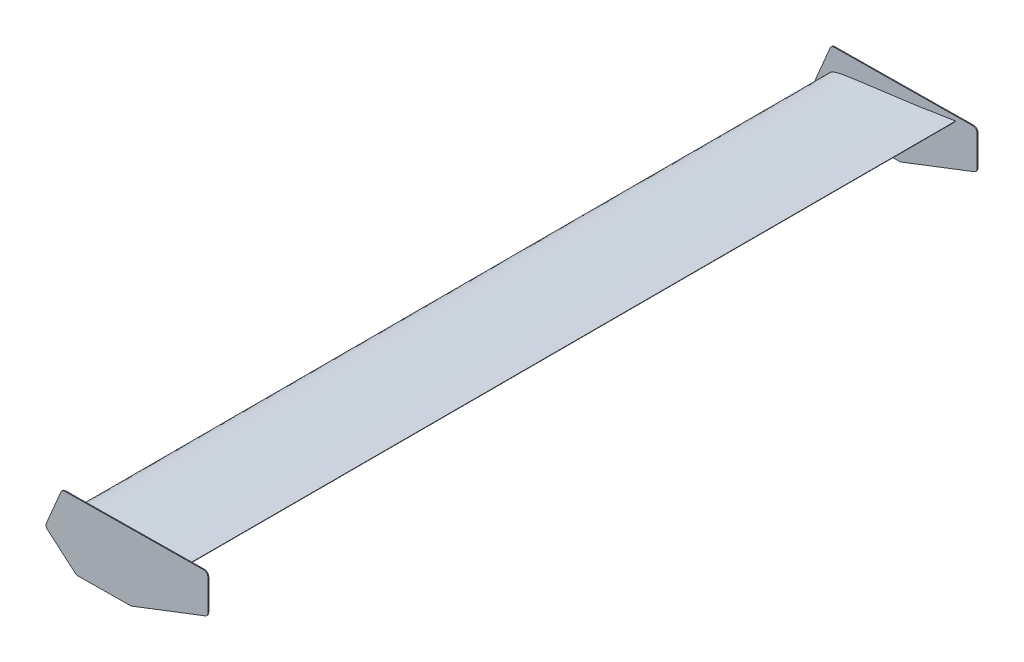
ISO-10303-21;
HEADER;
FILE_DESCRIPTION(('STEP AP214'),'2;1');
FILE_NAME('part.step','',(''),(''),'','','');
FILE_SCHEMA(('AUTOMOTIVE_DESIGN { 1 0 10303 214 1 1 1 1 }'));
ENDSEC;
DATA;
#1=APPLICATION_CONTEXT('core data for automotive mechanical design processes');
#2=APPLICATION_PROTOCOL_DEFINITION('international standard','automotive_design',2000,#1);
#3=PRODUCT_CONTEXT('',#1,'mechanical');
#4=PRODUCT('Part','Part','',(#3));
#5=PRODUCT_RELATED_PRODUCT_CATEGORY('part','',(#4));
#6=PRODUCT_DEFINITION_FORMATION('','',#4);
#7=PRODUCT_DEFINITION_CONTEXT('part definition',#1,'design');
#8=PRODUCT_DEFINITION('design','',#6,#7);
#9=PRODUCT_DEFINITION_SHAPE('','',#8);
#10=(LENGTH_UNIT() NAMED_UNIT(*) SI_UNIT(.MILLI.,.METRE.));
#11=(NAMED_UNIT(*) PLANE_ANGLE_UNIT() SI_UNIT($,.RADIAN.));
#12=(NAMED_UNIT(*) SI_UNIT($,.STERADIAN.) SOLID_ANGLE_UNIT());
#13=UNCERTAINTY_MEASURE_WITH_UNIT(LENGTH_MEASURE(1.E-05),#10,'distance_accuracy_value','');
#14=(GEOMETRIC_REPRESENTATION_CONTEXT(3) GLOBAL_UNCERTAINTY_ASSIGNED_CONTEXT((#13)) GLOBAL_UNIT_ASSIGNED_CONTEXT((#10,
#11,#12)) REPRESENTATION_CONTEXT('',''));
#15=CARTESIAN_POINT('',(0.,0.,0.));
#16=DIRECTION('',(0.,0.,1.));
#17=DIRECTION('',(1.,0.,0.));
#18=AXIS2_PLACEMENT_3D('',#15,#16,#17);
#19=CARTESIAN_POINT('',(0.,0.,899.));
#20=DIRECTION('',(0.,0.,-1.));
#21=DIRECTION('',(-1.,0.,0.));
#22=AXIS2_PLACEMENT_3D('',#19,#20,#21);
#23=PLANE('',#22);
#24=DIRECTION('',(-0.999947428083981,-0.0102538318804609,0.));
#25=VECTOR('',#24,1.);
#26=CARTESIAN_POINT('',(4.19836461655942,59.4066569608688,899.));
#27=LINE('',#26,#25);
#28=CARTESIAN_POINT('',(335.564783335885,62.8046111462092,899.));
#29=VERTEX_POINT('',#28);
#30=CARTESIAN_POINT('',(10.7496298097369,59.4738360644981,899.));
#31=VERTEX_POINT('',#30);
#32=EDGE_CURVE('E240',#29,#31,#27,.T.);
#33=ORIENTED_EDGE('',*,*,#32,.F.);
#34=CARTESIAN_POINT('',(335.667321654689,52.8051368653694,899.));
#35=DIRECTION('',(0.,0.,-1.));
#36=DIRECTION('',(-1.,0.,0.));
#37=AXIS2_PLACEMENT_3D('',#34,#35,#36);
#38=CIRCLE('',#37,10.);
#39=CARTESIAN_POINT('',(345.667321654689,52.8051368653694,899.));
#40=VERTEX_POINT('',#39);
#41=EDGE_CURVE('E277',#29,#40,#38,.T.);
#42=ORIENTED_EDGE('',*,*,#41,.T.);
#43=DIRECTION('',(0.,1.,0.));
#44=VECTOR('',#43,1.);
#45=CARTESIAN_POINT('',(345.667321654689,62.908206321893,899.));
#46=LINE('',#45,#44);
#47=CARTESIAN_POINT('',(345.667321654689,-19.4543841415105,899.));
#48=VERTEX_POINT('',#47);
#49=EDGE_CURVE('E439',#48,#40,#46,.T.);
#50=ORIENTED_EDGE('',*,*,#49,.F.);
#51=CARTESIAN_POINT('',(335.667321654689,-19.4543841415105,899.));
#52=DIRECTION('',(0.,0.,-1.));
#53=DIRECTION('',(-1.,0.,0.));
#54=AXIS2_PLACEMENT_3D('',#51,#52,#53);
#55=CIRCLE('',#54,10.);
#56=CARTESIAN_POINT('',(339.261892028957,-28.7860004979859,899.));
#57=VERTEX_POINT('',#56);
#58=EDGE_CURVE('E274',#48,#57,#55,.T.);
#59=ORIENTED_EDGE('',*,*,#58,.T.);
#60=DIRECTION('',(0.93316163564754,0.35945703742674,0.));
#61=VECTOR('',#60,1.);
#62=CARTESIAN_POINT('',(166.275090380422,-95.4211051348804,899.));
#63=LINE('',#62,#61);
#64=CARTESIAN_POINT('',(167.960784377593,-94.7717700710672,899.));
#65=VERTEX_POINT('',#64);
#66=EDGE_CURVE('E474',#65,#57,#63,.T.);
#67=ORIENTED_EDGE('',*,*,#66,.F.);
#68=CARTESIAN_POINT('',(164.366214003326,-85.4401537145918,899.));
#69=DIRECTION('',(0.,0.,-1.));
#70=DIRECTION('',(-1.,0.,0.));
#71=AXIS2_PLACEMENT_3D('',#68,#69,#70);
#72=CIRCLE('',#71,10.);
#73=CARTESIAN_POINT('',(164.46875232213,-95.4396279954316,899.));
#74=VERTEX_POINT('',#73);
#75=EDGE_CURVE('E271',#65,#74,#72,.T.);
#76=ORIENTED_EDGE('',*,*,#75,.T.);
#77=DIRECTION('',(0.99994742808398,0.010253831880461,0.));
#78=VECTOR('',#77,1.);
#79=CARTESIAN_POINT('',(38.2575012573376,-96.7338449847395,899.));
#80=LINE('',#79,#78);
#81=CARTESIAN_POINT('',(42.0078617050286,-96.6953873974287,899.));
#82=VERTEX_POINT('',#81);
#83=EDGE_CURVE('E470',#82,#74,#80,.T.);
#84=ORIENTED_EDGE('',*,*,#83,.F.);
#85=CARTESIAN_POINT('',(41.905323386224,-86.6959131165889,899.));
#86=DIRECTION('',(0.,0.,-1.));
#87=DIRECTION('',(-1.,0.,0.));
#88=AXIS2_PLACEMENT_3D('',#85,#86,#87);
#89=CIRCLE('',#88,10.);
#90=CARTESIAN_POINT('',(35.4068383285812,-94.2965507185006,899.));
#91=VERTEX_POINT('',#90);
#92=EDGE_CURVE('E262',#82,#91,#89,.T.);
#93=ORIENTED_EDGE('',*,*,#92,.T.);
#94=DIRECTION('',(0.760063760191166,-0.649848505764278,0.));
#95=VECTOR('',#94,1.);
#96=CARTESIAN_POINT('',(-35.2909208199958,-33.8505255955157,899.));
#97=LINE('',#96,#95);
#98=CARTESIAN_POINT('',(-29.7260776200808,-38.6084225348037,899.));
#99=VERTEX_POINT('',#98);
#100=EDGE_CURVE('E466',#99,#91,#97,.T.);
#101=ORIENTED_EDGE('',*,*,#100,.F.);
#102=CARTESIAN_POINT('',(-23.227592562438,-31.007784932892,899.));
#103=DIRECTION('',(0.,0.,-1.));
#104=DIRECTION('',(-1.,0.,0.));
#105=AXIS2_PLACEMENT_3D('',#102,#103,#104);
#106=CIRCLE('',#105,10.);
#107=CARTESIAN_POINT('',(-32.4360484248066,-27.1085105605493,899.));
#108=VERTEX_POINT('',#107);
#109=EDGE_CURVE('E265',#99,#108,#106,.T.);
#110=ORIENTED_EDGE('',*,*,#109,.T.);
#111=DIRECTION('',(-0.38992743723427,-0.920845586236864,0.));
#112=VECTOR('',#111,1.);
#113=CARTESIAN_POINT('',(4.19836461655942,59.4066569608688,899.));
#114=LINE('',#113,#112);
#115=CARTESIAN_POINT('',(1.64371226617284,53.373636156001,899.));
#116=VERTEX_POINT('',#115);
#117=EDGE_CURVE('E462',#116,#108,#114,.T.);
#118=ORIENTED_EDGE('',*,*,#117,.F.);
#119=CARTESIAN_POINT('',(10.8521681285415,49.4743617836583,899.));
#120=DIRECTION('',(0.,0.,-1.));
#121=DIRECTION('',(-1.,0.,0.));
#122=AXIS2_PLACEMENT_3D('',#119,#120,#121);
#123=CIRCLE('',#122,10.);
#124=EDGE_CURVE('E268',#116,#31,#123,.T.);
#125=ORIENTED_EDGE('',*,*,#124,.T.);
#126=EDGE_LOOP('',(#33,#42,#50,#59,#67,#76,#84,#93,#101,#110,#118,#125));
#127=FACE_BOUND('',#126,.T.);
#128=CARTESIAN_POINT('',(295.442575552322,52.0944973198736,899.));
#129=CARTESIAN_POINT('',(290.513405360213,51.2551968737166,899.));
#130=CARTESIAN_POINT('',(280.654798817571,49.5765506620336,899.));
#131=CARTESIAN_POINT('',(260.908662248569,46.3874090889857,899.));
#132=CARTESIAN_POINT('',(236.21205861254,42.4700071835736,899.));
#133=CARTESIAN_POINT('',(206.524649131341,38.0711542068682,899.));
#134=CARTESIAN_POINT('',(176.791016387995,33.9503967885851,899.));
#135=CARTESIAN_POINT('',(147.028226767683,30.0129140809486,899.));
#136=CARTESIAN_POINT('',(117.277393969403,25.9511793318881,899.));
#137=CARTESIAN_POINT('',(92.448783550698,22.8250936622745,899.));
#138=CARTESIAN_POINT('',(72.5868221191492,20.2991131861254,899.));
#139=CARTESIAN_POINT('',(57.6806379696287,18.5022860247391,899.));
#140=CARTESIAN_POINT('',(42.8294512378161,16.3297474729015,899.));
#141=CARTESIAN_POINT('',(30.503324848176,14.208402507249,899.));
#142=CARTESIAN_POINT('',(20.7218923500691,12.0219474188099,899.));
#143=CARTESIAN_POINT('',(13.4174215074088,10.072827447969,899.));
#144=CARTESIAN_POINT('',(7.36001882994766,7.69323810880284,899.));
#145=CARTESIAN_POINT('',(2.41756609867938,4.87324860729172,899.));
#146=CARTESIAN_POINT('',(-1.90572150955162,-0.864008686683522,899.));
#147=CARTESIAN_POINT('',(3.98891879431421,-6.3451713298435,899.));
#148=CARTESIAN_POINT('',(10.1776980472486,-9.31157314368899,899.));
#149=CARTESIAN_POINT('',(17.0903093663387,-11.4872077239985,899.));
#150=CARTESIAN_POINT('',(25.0496216231774,-13.2246530775742,899.));
#151=CARTESIAN_POINT('',(35.4635386523064,-14.7181035313228,899.));
#152=CARTESIAN_POINT('',(48.3138554344482,-15.7525222262547,899.));
#153=CARTESIAN_POINT('',(63.6119343730892,-15.805428879694,899.));
#154=CARTESIAN_POINT('',(78.7288203963591,-15.0112954978334,899.));
#155=CARTESIAN_POINT('',(98.6775886020674,-12.9258913981769,899.));
#156=CARTESIAN_POINT('',(123.359896769198,-8.58669721404438,899.));
#157=CARTESIAN_POINT('',(152.592609753486,-1.48249306985702,899.));
#158=CARTESIAN_POINT('',(181.624153973967,6.78650927043338,899.));
#159=CARTESIAN_POINT('',(210.421609352754,16.2962672485336,899.));
#160=CARTESIAN_POINT('',(239.075022796545,26.7642384033183,899.));
#161=CARTESIAN_POINT('',(262.727569494105,36.4359060625289,899.));
#162=CARTESIAN_POINT('',(281.542489296852,44.7358642078229,899.));
#163=CARTESIAN_POINT('',(290.891307166424,49.1258631647304,899.));
#164=CARTESIAN_POINT('',(295.577022422233,51.3261718425066,899.));
#165=B_SPLINE_CURVE_WITH_KNOTS('',3,(#128,#129,#130,#131,#132,#133,#134,#135,#136,#137,#138,
#139,#140,#141,#142,#143,#144,#145,#146,#147,#148,#149,#150,#151,#152,#153,#154,#155,#156,#157,
#158,#159,#160,#161,#162,#163,#164),.UNSPECIFIED.,.F.,.F.,(4,1,1,1,1,1,1,1,1,1,1,1,1,1,1,1,1,1,
1,1,1,1,1,1,1,1,1,1,1,1,1,1,1,1,4),(0.,0.0244427721061945,0.0488868640389345,0.0977785916589877,
0.146679776180424,0.195594373169575,0.244518129566772,0.293441885963969,0.342378242904188,
0.366848716418896,0.391319189933605,0.415771101598765,0.440213629284816,0.45244886604217,
0.464730985941134,0.477233997408243,0.483852229950494,0.493136970824156,0.506538949171679,
0.514213997148271,0.528080018214651,0.541297784208939,0.554174880744231,0.579429854643616,
0.604273702829676,0.628897262955146,0.653399405638713,0.702284461010814,0.751259990775971,
0.800413393105454,0.849809284276661,0.899479567348494,0.949512346609459,0.974695114289043,1.),.UNSPECIFIED.);
#166=CARTESIAN_POINT('',(295.577022422233,51.3261718425066,899.));
#167=VERTEX_POINT('',#166);
#168=CARTESIAN_POINT('',(295.442575552322,52.0944973198736,899.));
#169=VERTEX_POINT('',#168);
#170=EDGE_CURVE('E252',#167,#169,#165,.F.);
#171=ORIENTED_EDGE('',*,*,#170,.F.);
#172=DIRECTION('',(0.172367781937305,-0.985032663290926,0.));
#173=VECTOR('',#172,1.);
#174=CARTESIAN_POINT('',(295.442575552322,52.0944973198736,899.));
#175=LINE('',#174,#173);
#176=EDGE_CURVE('E245',#169,#167,#175,.T.);
#177=ORIENTED_EDGE('',*,*,#176,.F.);
#178=EDGE_LOOP('',(#171,#177));
#179=FACE_BOUND('',#178,.T.);
#180=ADVANCED_FACE('F47',(#127,#179),#23,.T.);
#181=CARTESIAN_POINT('',(4.19836461655942,59.4066569608688,901.));
#182=DIRECTION('',(0.0102538318804609,-0.999947428083981,0.));
#183=DIRECTION('',(0.999947428083981,0.0102538318804609,0.));
#184=AXIS2_PLACEMENT_3D('',#181,#182,#183);
#185=PLANE('',#184);
#186=DIRECTION('',(-0.999947428083981,-0.0102538318804609,0.));
#187=VECTOR('',#186,1.);
#188=CARTESIAN_POINT('',(4.19836461655942,59.4066569608688,901.));
#189=LINE('',#188,#187);
#190=CARTESIAN_POINT('',(335.564783335885,62.8046111462092,901.));
#191=VERTEX_POINT('',#190);
#192=CARTESIAN_POINT('',(10.7496298097369,59.4738360644981,901.));
#193=VERTEX_POINT('',#192);
#194=EDGE_CURVE('E431',#191,#193,#189,.T.);
#195=ORIENTED_EDGE('',*,*,#194,.F.);
#196=DIRECTION('',(0.,0.,-1.));
#197=VECTOR('',#196,1.);
#198=CARTESIAN_POINT('',(335.564783335885,62.8046111462092,901.));
#199=LINE('',#198,#197);
#200=EDGE_CURVE('E258',#191,#29,#199,.T.);
#201=ORIENTED_EDGE('',*,*,#200,.T.);
#202=ORIENTED_EDGE('',*,*,#32,.T.);
#203=DIRECTION('',(0.,0.,-1.));
#204=VECTOR('',#203,1.);
#205=CARTESIAN_POINT('',(10.7496298097369,59.4738360644981,901.));
#206=LINE('',#205,#204);
#207=EDGE_CURVE('E250',#31,#193,#206,.F.);
#208=ORIENTED_EDGE('',*,*,#207,.T.);
#209=EDGE_LOOP('',(#195,#201,#202,#208));
#210=FACE_BOUND('',#209,.T.);
#211=ADVANCED_FACE('F546',(#210),#185,.F.);
#212=CARTESIAN_POINT('',(4.19836461655942,59.4066569608688,901.));
#213=DIRECTION('',(0.920845586236864,-0.38992743723427,0.));
#214=DIRECTION('',(0.38992743723427,0.920845586236864,0.));
#215=AXIS2_PLACEMENT_3D('',#212,#213,#214);
#216=PLANE('',#215);
#217=DIRECTION('',(-0.38992743723427,-0.920845586236864,0.));
#218=VECTOR('',#217,1.);
#219=CARTESIAN_POINT('',(4.19836461655942,59.4066569608688,901.));
#220=LINE('',#219,#218);
#221=CARTESIAN_POINT('',(1.64371226617284,53.373636156001,901.));
#222=VERTEX_POINT('',#221);
#223=CARTESIAN_POINT('',(-32.4360484248066,-27.1085105605493,901.));
#224=VERTEX_POINT('',#223);
#225=EDGE_CURVE('E438',#222,#224,#220,.T.);
#226=ORIENTED_EDGE('',*,*,#225,.F.);
#227=DIRECTION('',(0.,0.,-1.));
#228=VECTOR('',#227,1.);
#229=CARTESIAN_POINT('',(1.64371226617284,53.373636156001,901.));
#230=LINE('',#229,#228);
#231=EDGE_CURVE('E322',#222,#116,#230,.T.);
#232=ORIENTED_EDGE('',*,*,#231,.T.);
#233=ORIENTED_EDGE('',*,*,#117,.T.);
#234=DIRECTION('',(0.,0.,-1.));
#235=VECTOR('',#234,1.);
#236=CARTESIAN_POINT('',(-32.4360484248066,-27.1085105605493,901.));
#237=LINE('',#236,#235);
#238=EDGE_CURVE('E319',#108,#224,#237,.F.);
#239=ORIENTED_EDGE('',*,*,#238,.T.);
#240=EDGE_LOOP('',(#226,#232,#233,#239));
#241=FACE_BOUND('',#240,.T.);
#242=ADVANCED_FACE('F552',(#241),#216,.F.);
#243=CARTESIAN_POINT('',(-35.2909208199958,-33.8505255955157,901.));
#244=DIRECTION('',(0.649848505764278,0.760063760191167,0.));
#245=DIRECTION('',(-0.760063760191167,0.649848505764278,0.));
#246=AXIS2_PLACEMENT_3D('',#243,#244,#245);
#247=PLANE('',#246);
#248=DIRECTION('',(0.760063760191166,-0.649848505764278,0.));
#249=VECTOR('',#248,1.);
#250=CARTESIAN_POINT('',(-35.2909208199958,-33.8505255955157,901.));
#251=LINE('',#250,#249);
#252=CARTESIAN_POINT('',(-29.7260776200808,-38.6084225348037,901.));
#253=VERTEX_POINT('',#252);
#254=CARTESIAN_POINT('',(35.4068383285812,-94.2965507185006,901.));
#255=VERTEX_POINT('',#254);
#256=EDGE_CURVE('E443',#253,#255,#251,.T.);
#257=ORIENTED_EDGE('',*,*,#256,.F.);
#258=DIRECTION('',(0.,0.,-1.));
#259=VECTOR('',#258,1.);
#260=CARTESIAN_POINT('',(-29.7260776200808,-38.6084225348037,901.));
#261=LINE('',#260,#259);
#262=EDGE_CURVE('E231',#253,#99,#261,.T.);
#263=ORIENTED_EDGE('',*,*,#262,.T.);
#264=ORIENTED_EDGE('',*,*,#100,.T.);
#265=DIRECTION('',(0.,0.,-1.));
#266=VECTOR('',#265,1.);
#267=CARTESIAN_POINT('',(35.4068383285812,-94.2965507185006,901.));
#268=LINE('',#267,#266);
#269=EDGE_CURVE('E326',#91,#255,#268,.F.);
#270=ORIENTED_EDGE('',*,*,#269,.T.);
#271=EDGE_LOOP('',(#257,#263,#264,#270));
#272=FACE_BOUND('',#271,.T.);
#273=ADVANCED_FACE('F570',(#272),#247,.F.);
#274=CARTESIAN_POINT('',(38.2575012573376,-96.7338449847395,901.));
#275=DIRECTION('',(-0.010253831880461,0.999947428083981,0.));
#276=DIRECTION('',(-0.999947428083981,-0.010253831880461,0.));
#277=AXIS2_PLACEMENT_3D('',#274,#275,#276);
#278=PLANE('',#277);
#279=ORIENTED_EDGE('',*,*,#83,.T.);
#280=DIRECTION('',(0.,0.,-1.));
#281=VECTOR('',#280,1.);
#282=CARTESIAN_POINT('',(164.46875232213,-95.4396279954316,901.));
#283=LINE('',#282,#281);
#284=CARTESIAN_POINT('',(164.46875232213,-95.4396279954316,901.));
#285=VERTEX_POINT('',#284);
#286=EDGE_CURVE('E316',#74,#285,#283,.F.);
#287=ORIENTED_EDGE('',*,*,#286,.T.);
#288=DIRECTION('',(0.99994742808398,0.010253831880461,0.));
#289=VECTOR('',#288,1.);
#290=CARTESIAN_POINT('',(38.2575012573376,-96.7338449847395,901.));
#291=LINE('',#290,#289);
#292=CARTESIAN_POINT('',(42.0078617050286,-96.6953873974287,901.));
#293=VERTEX_POINT('',#292);
#294=EDGE_CURVE('E447',#293,#285,#291,.T.);
#295=ORIENTED_EDGE('',*,*,#294,.F.);
#296=DIRECTION('',(0.,0.,-1.));
#297=VECTOR('',#296,1.);
#298=CARTESIAN_POINT('',(42.0078617050286,-96.6953873974287,901.));
#299=LINE('',#298,#297);
#300=EDGE_CURVE('E312',#293,#82,#299,.T.);
#301=ORIENTED_EDGE('',*,*,#300,.T.);
#302=EDGE_LOOP('',(#279,#287,#295,#301));
#303=FACE_BOUND('',#302,.T.);
#304=ADVANCED_FACE('F566',(#303),#278,.F.);
#305=CARTESIAN_POINT('',(166.275090380422,-95.4211051348804,901.));
#306=DIRECTION('',(-0.359457037426739,0.93316163564754,0.));
#307=DIRECTION('',(-0.93316163564754,-0.35945703742674,0.));
#308=AXIS2_PLACEMENT_3D('',#305,#306,#307);
#309=PLANE('',#308);
#310=ORIENTED_EDGE('',*,*,#66,.T.);
#311=DIRECTION('',(0.,0.,-1.));
#312=VECTOR('',#311,1.);
#313=CARTESIAN_POINT('',(339.261892028957,-28.7860004979859,901.));
#314=LINE('',#313,#312);
#315=CARTESIAN_POINT('',(339.261892028957,-28.7860004979859,901.));
#316=VERTEX_POINT('',#315);
#317=EDGE_CURVE('E309',#57,#316,#314,.F.);
#318=ORIENTED_EDGE('',*,*,#317,.T.);
#319=DIRECTION('',(0.93316163564754,0.35945703742674,0.));
#320=VECTOR('',#319,1.);
#321=CARTESIAN_POINT('',(166.275090380422,-95.4211051348804,901.));
#322=LINE('',#321,#320);
#323=CARTESIAN_POINT('',(167.960784377593,-94.7717700710672,901.));
#324=VERTEX_POINT('',#323);
#325=EDGE_CURVE('E451',#324,#316,#322,.T.);
#326=ORIENTED_EDGE('',*,*,#325,.F.);
#327=DIRECTION('',(0.,0.,-1.));
#328=VECTOR('',#327,1.);
#329=CARTESIAN_POINT('',(167.960784377593,-94.7717700710672,901.));
#330=LINE('',#329,#328);
#331=EDGE_CURVE('E305',#324,#65,#330,.T.);
#332=ORIENTED_EDGE('',*,*,#331,.T.);
#333=EDGE_LOOP('',(#310,#318,#326,#332));
#334=FACE_BOUND('',#333,.T.);
#335=ADVANCED_FACE('F562',(#334),#309,.F.);
#336=CARTESIAN_POINT('',(345.667321654689,62.908206321893,901.));
#337=DIRECTION('',(-1.,0.,0.));
#338=DIRECTION('',(0.,0.,1.));
#339=AXIS2_PLACEMENT_3D('',#336,#337,#338);
#340=PLANE('',#339);
#341=ORIENTED_EDGE('',*,*,#49,.T.);
#342=DIRECTION('',(0.,0.,-1.));
#343=VECTOR('',#342,1.);
#344=CARTESIAN_POINT('',(345.667321654689,52.8051368653694,901.));
#345=LINE('',#344,#343);
#346=CARTESIAN_POINT('',(345.667321654689,52.8051368653694,901.));
#347=VERTEX_POINT('',#346);
#348=EDGE_CURVE('E284',#40,#347,#345,.F.);
#349=ORIENTED_EDGE('',*,*,#348,.T.);
#350=DIRECTION('',(0.,1.,0.));
#351=VECTOR('',#350,1.);
#352=CARTESIAN_POINT('',(345.667321654689,62.908206321893,901.));
#353=LINE('',#352,#351);
#354=CARTESIAN_POINT('',(345.667321654689,-19.4543841415105,901.));
#355=VERTEX_POINT('',#354);
#356=EDGE_CURVE('E455',#355,#347,#353,.T.);
#357=ORIENTED_EDGE('',*,*,#356,.F.);
#358=DIRECTION('',(0.,0.,-1.));
#359=VECTOR('',#358,1.);
#360=CARTESIAN_POINT('',(345.667321654689,-19.4543841415105,901.));
#361=LINE('',#360,#359);
#362=EDGE_CURVE('E280',#355,#48,#361,.T.);
#363=ORIENTED_EDGE('',*,*,#362,.T.);
#364=EDGE_LOOP('',(#341,#349,#357,#363));
#365=FACE_BOUND('',#364,.T.);
#366=ADVANCED_FACE('F559',(#365),#340,.F.);
#367=CARTESIAN_POINT('',(0.,0.,901.));
#368=DIRECTION('',(0.,0.,-1.));
#369=DIRECTION('',(-1.,0.,0.));
#370=AXIS2_PLACEMENT_3D('',#367,#368,#369);
#371=PLANE('',#370);
#372=ORIENTED_EDGE('',*,*,#356,.T.);
#373=CARTESIAN_POINT('',(335.667321654689,52.8051368653694,901.));
#374=DIRECTION('',(0.,0.,-1.));
#375=DIRECTION('',(-1.,0.,0.));
#376=AXIS2_PLACEMENT_3D('',#373,#374,#375);
#377=CIRCLE('',#376,10.);
#378=EDGE_CURVE('E302',#347,#191,#377,.F.);
#379=ORIENTED_EDGE('',*,*,#378,.T.);
#380=ORIENTED_EDGE('',*,*,#194,.T.);
#381=CARTESIAN_POINT('',(10.8521681285415,49.4743617836583,901.));
#382=DIRECTION('',(0.,0.,-1.));
#383=DIRECTION('',(-1.,0.,0.));
#384=AXIS2_PLACEMENT_3D('',#381,#382,#383);
#385=CIRCLE('',#384,10.);
#386=EDGE_CURVE('E293',#193,#222,#385,.F.);
#387=ORIENTED_EDGE('',*,*,#386,.T.);
#388=ORIENTED_EDGE('',*,*,#225,.T.);
#389=CARTESIAN_POINT('',(-23.227592562438,-31.007784932892,901.));
#390=DIRECTION('',(0.,0.,-1.));
#391=DIRECTION('',(-1.,0.,0.));
#392=AXIS2_PLACEMENT_3D('',#389,#390,#391);
#393=CIRCLE('',#392,10.);
#394=EDGE_CURVE('E290',#224,#253,#393,.F.);
#395=ORIENTED_EDGE('',*,*,#394,.T.);
#396=ORIENTED_EDGE('',*,*,#256,.T.);
#397=CARTESIAN_POINT('',(41.905323386224,-86.6959131165889,901.));
#398=DIRECTION('',(0.,0.,-1.));
#399=DIRECTION('',(-1.,0.,0.));
#400=AXIS2_PLACEMENT_3D('',#397,#398,#399);
#401=CIRCLE('',#400,10.);
#402=EDGE_CURVE('E287',#255,#293,#401,.F.);
#403=ORIENTED_EDGE('',*,*,#402,.T.);
#404=ORIENTED_EDGE('',*,*,#294,.T.);
#405=CARTESIAN_POINT('',(164.366214003326,-85.4401537145918,901.));
#406=DIRECTION('',(0.,0.,-1.));
#407=DIRECTION('',(-1.,0.,0.));
#408=AXIS2_PLACEMENT_3D('',#405,#406,#407);
#409=CIRCLE('',#408,10.);
#410=EDGE_CURVE('E296',#285,#324,#409,.F.);
#411=ORIENTED_EDGE('',*,*,#410,.T.);
#412=ORIENTED_EDGE('',*,*,#325,.T.);
#413=CARTESIAN_POINT('',(335.667321654689,-19.4543841415105,901.));
#414=DIRECTION('',(0.,0.,-1.));
#415=DIRECTION('',(-1.,0.,0.));
#416=AXIS2_PLACEMENT_3D('',#413,#414,#415);
#417=CIRCLE('',#416,10.);
#418=EDGE_CURVE('E299',#316,#355,#417,.F.);
#419=ORIENTED_EDGE('',*,*,#418,.T.);
#420=EDGE_LOOP('',(#372,#379,#380,#387,#388,#395,#396,#403,#404,#411,#412,#419));
#421=FACE_BOUND('',#420,.T.);
#422=ADVANCED_FACE('F497',(#421),#371,.F.);
#423=CARTESIAN_POINT('',(295.442575552322,52.0944973198736,900.));
#424=CARTESIAN_POINT('',(290.513405360213,51.2551968737166,900.));
#425=CARTESIAN_POINT('',(280.654798817571,49.5765506620336,900.));
#426=CARTESIAN_POINT('',(260.908662248569,46.3874090889857,900.));
#427=CARTESIAN_POINT('',(236.21205861254,42.4700071835736,900.));
#428=CARTESIAN_POINT('',(206.524649131341,38.0711542068682,900.));
#429=CARTESIAN_POINT('',(176.791016387995,33.9503967885851,900.));
#430=CARTESIAN_POINT('',(147.028226767683,30.0129140809486,900.));
#431=CARTESIAN_POINT('',(117.277393969403,25.9511793318881,900.));
#432=CARTESIAN_POINT('',(92.448783550698,22.8250936622745,900.));
#433=CARTESIAN_POINT('',(72.5868221191492,20.2991131861254,900.));
#434=CARTESIAN_POINT('',(57.6806379696287,18.5022860247391,900.));
#435=CARTESIAN_POINT('',(42.8294512378161,16.3297474729015,900.));
#436=CARTESIAN_POINT('',(30.503324848176,14.208402507249,900.));
#437=CARTESIAN_POINT('',(20.7218923500691,12.0219474188099,900.));
#438=CARTESIAN_POINT('',(13.4174215074088,10.072827447969,900.));
#439=CARTESIAN_POINT('',(7.36001882994766,7.69323810880284,900.));
#440=CARTESIAN_POINT('',(2.41756609867938,4.87324860729172,900.));
#441=CARTESIAN_POINT('',(-1.90572150955162,-0.864008686683522,900.));
#442=CARTESIAN_POINT('',(3.98891879431421,-6.3451713298435,900.));
#443=CARTESIAN_POINT('',(10.1776980472486,-9.31157314368899,900.));
#444=CARTESIAN_POINT('',(17.0903093663387,-11.4872077239985,900.));
#445=CARTESIAN_POINT('',(25.0496216231774,-13.2246530775742,900.));
#446=CARTESIAN_POINT('',(35.4635386523064,-14.7181035313228,900.));
#447=CARTESIAN_POINT('',(48.3138554344482,-15.7525222262547,900.));
#448=CARTESIAN_POINT('',(63.6119343730892,-15.805428879694,900.));
#449=CARTESIAN_POINT('',(78.7288203963591,-15.0112954978334,900.));
#450=CARTESIAN_POINT('',(98.6775886020674,-12.9258913981769,900.));
#451=CARTESIAN_POINT('',(123.359896769198,-8.58669721404438,900.));
#452=CARTESIAN_POINT('',(152.592609753486,-1.48249306985702,900.));
#453=CARTESIAN_POINT('',(181.624153973967,6.78650927043338,900.));
#454=CARTESIAN_POINT('',(210.421609352754,16.2962672485336,900.));
#455=CARTESIAN_POINT('',(239.075022796545,26.7642384033183,900.));
#456=CARTESIAN_POINT('',(262.727569494105,36.4359060625289,900.));
#457=CARTESIAN_POINT('',(281.542489296852,44.7358642078229,900.));
#458=CARTESIAN_POINT('',(290.891307166424,49.1258631647304,900.));
#459=CARTESIAN_POINT('',(295.577022422233,51.3261718425066,900.));
#460=B_SPLINE_CURVE_WITH_KNOTS('',3,(#423,#424,#425,#426,#427,#428,#429,#430,#431,#432,#433,
#434,#435,#436,#437,#438,#439,#440,#441,#442,#443,#444,#445,#446,#447,#448,#449,#450,#451,#452,
#453,#454,#455,#456,#457,#458,#459),.UNSPECIFIED.,.F.,.F.,(4,1,1,1,1,1,1,1,1,1,1,1,1,1,1,1,1,1,
1,1,1,1,1,1,1,1,1,1,1,1,1,1,1,1,4),(0.,0.0244427721061945,0.0488868640389345,0.0977785916589877,
0.146679776180424,0.195594373169575,0.244518129566772,0.293441885963969,0.342378242904188,
0.366848716418896,0.391319189933605,0.415771101598765,0.440213629284816,0.45244886604217,
0.464730985941134,0.477233997408243,0.483852229950494,0.493136970824156,0.506538949171679,
0.514213997148271,0.528080018214651,0.541297784208939,0.554174880744231,0.579429854643616,
0.604273702829676,0.628897262955146,0.653399405638713,0.702284461010814,0.751259990775971,
0.800413393105454,0.849809284276661,0.899479567348494,0.949512346609459,0.974695114289043,1.),.UNSPECIFIED.);
#461=DIRECTION('',(0.,0.,-1.));
#462=VECTOR('',#461,1.);
#463=SURFACE_OF_LINEAR_EXTRUSION('',#460,#462);
#464=DIRECTION('',(0.,0.,-1.));
#465=VECTOR('',#464,1.);
#466=CARTESIAN_POINT('',(295.442575552322,52.0944973198736,900.));
#467=LINE('',#466,#465);
#468=CARTESIAN_POINT('',(295.442575552322,52.0944973198736,-899.));
#469=VERTEX_POINT('',#468);
#470=EDGE_CURVE('E238',#169,#469,#467,.T.);
#471=ORIENTED_EDGE('',*,*,#470,.T.);
#472=CARTESIAN_POINT('',(295.442575552322,52.0944973198736,-899.));
#473=CARTESIAN_POINT('',(290.513405360213,51.2551968737166,-899.));
#474=CARTESIAN_POINT('',(280.654798817571,49.5765506620336,-899.));
#475=CARTESIAN_POINT('',(260.908662248569,46.3874090889857,-899.));
#476=CARTESIAN_POINT('',(236.21205861254,42.4700071835736,-899.));
#477=CARTESIAN_POINT('',(206.524649131341,38.0711542068682,-899.));
#478=CARTESIAN_POINT('',(176.791016387995,33.9503967885851,-899.));
#479=CARTESIAN_POINT('',(147.028226767683,30.0129140809486,-899.));
#480=CARTESIAN_POINT('',(117.277393969403,25.9511793318881,-899.));
#481=CARTESIAN_POINT('',(92.448783550698,22.8250936622745,-899.));
#482=CARTESIAN_POINT('',(72.5868221191492,20.2991131861254,-899.));
#483=CARTESIAN_POINT('',(57.6806379696287,18.5022860247391,-899.));
#484=CARTESIAN_POINT('',(42.8294512378161,16.3297474729015,-899.));
#485=CARTESIAN_POINT('',(30.503324848176,14.208402507249,-899.));
#486=CARTESIAN_POINT('',(20.7218923500691,12.0219474188099,-899.));
#487=CARTESIAN_POINT('',(13.4174215074088,10.072827447969,-899.));
#488=CARTESIAN_POINT('',(7.36001882994766,7.69323810880284,-899.));
#489=CARTESIAN_POINT('',(2.41756609867938,4.87324860729172,-899.));
#490=CARTESIAN_POINT('',(-1.90572150955162,-0.864008686683522,-899.));
#491=CARTESIAN_POINT('',(3.98891879431421,-6.3451713298435,-899.));
#492=CARTESIAN_POINT('',(10.1776980472486,-9.31157314368899,-899.));
#493=CARTESIAN_POINT('',(17.0903093663387,-11.4872077239985,-899.));
#494=CARTESIAN_POINT('',(25.0496216231774,-13.2246530775742,-899.));
#495=CARTESIAN_POINT('',(35.4635386523064,-14.7181035313228,-899.));
#496=CARTESIAN_POINT('',(48.3138554344482,-15.7525222262547,-899.));
#497=CARTESIAN_POINT('',(63.6119343730892,-15.805428879694,-899.));
#498=CARTESIAN_POINT('',(78.7288203963591,-15.0112954978334,-899.));
#499=CARTESIAN_POINT('',(98.6775886020674,-12.9258913981769,-899.));
#500=CARTESIAN_POINT('',(123.359896769198,-8.58669721404438,-899.));
#501=CARTESIAN_POINT('',(152.592609753486,-1.48249306985702,-899.));
#502=CARTESIAN_POINT('',(181.624153973967,6.78650927043338,-899.));
#503=CARTESIAN_POINT('',(210.421609352754,16.2962672485336,-899.));
#504=CARTESIAN_POINT('',(239.075022796545,26.7642384033183,-899.));
#505=CARTESIAN_POINT('',(262.727569494105,36.4359060625289,-899.));
#506=CARTESIAN_POINT('',(281.542489296852,44.7358642078229,-899.));
#507=CARTESIAN_POINT('',(290.891307166424,49.1258631647304,-899.));
#508=CARTESIAN_POINT('',(295.577022422233,51.3261718425066,-899.));
#509=B_SPLINE_CURVE_WITH_KNOTS('',3,(#472,#473,#474,#475,#476,#477,#478,#479,#480,#481,#482,
#483,#484,#485,#486,#487,#488,#489,#490,#491,#492,#493,#494,#495,#496,#497,#498,#499,#500,#501,
#502,#503,#504,#505,#506,#507,#508),.UNSPECIFIED.,.F.,.F.,(4,1,1,1,1,1,1,1,1,1,1,1,1,1,1,1,1,1,
1,1,1,1,1,1,1,1,1,1,1,1,1,1,1,1,4),(0.,0.0244427721061945,0.0488868640389345,0.0977785916589877,
0.146679776180424,0.195594373169575,0.244518129566772,0.293441885963969,0.342378242904188,
0.366848716418896,0.391319189933605,0.415771101598765,0.440213629284816,0.45244886604217,
0.464730985941134,0.477233997408243,0.483852229950494,0.493136970824156,0.506538949171679,
0.514213997148271,0.528080018214651,0.541297784208939,0.554174880744231,0.579429854643616,
0.604273702829676,0.628897262955146,0.653399405638713,0.702284461010814,0.751259990775971,
0.800413393105454,0.849809284276661,0.899479567348494,0.949512346609459,0.974695114289043,1.),.UNSPECIFIED.);
#510=CARTESIAN_POINT('',(295.577022422233,51.3261718425066,-899.));
#511=VERTEX_POINT('',#510);
#512=EDGE_CURVE('E224',#469,#511,#509,.T.);
#513=ORIENTED_EDGE('',*,*,#512,.T.);
#514=DIRECTION('',(0.,0.,-1.));
#515=VECTOR('',#514,1.);
#516=CARTESIAN_POINT('',(295.577022422233,51.3261718425066,900.));
#517=LINE('',#516,#515);
#518=EDGE_CURVE('E237',#167,#511,#517,.T.);
#519=ORIENTED_EDGE('',*,*,#518,.F.);
#520=ORIENTED_EDGE('',*,*,#170,.T.);
#521=EDGE_LOOP('',(#471,#513,#519,#520));
#522=FACE_BOUND('',#521,.T.);
#523=ADVANCED_FACE('F235',(#522),#463,.F.);
#524=CARTESIAN_POINT('',(295.442575552322,52.0944973198736,900.));
#525=DIRECTION('',(-0.985032663290926,-0.172367781937305,0.));
#526=DIRECTION('',(0.172367781937305,-0.985032663290926,0.));
#527=AXIS2_PLACEMENT_3D('',#524,#525,#526);
#528=PLANE('',#527);
#529=ORIENTED_EDGE('',*,*,#518,.T.);
#530=DIRECTION('',(-0.172367781937305,0.985032663290926,0.));
#531=VECTOR('',#530,1.);
#532=CARTESIAN_POINT('',(295.442575552322,52.0944973198736,-899.));
#533=LINE('',#532,#531);
#534=EDGE_CURVE('E221',#511,#469,#533,.T.);
#535=ORIENTED_EDGE('',*,*,#534,.T.);
#536=ORIENTED_EDGE('',*,*,#470,.F.);
#537=ORIENTED_EDGE('',*,*,#176,.T.);
#538=EDGE_LOOP('',(#529,#535,#536,#537));
#539=FACE_BOUND('',#538,.T.);
#540=ADVANCED_FACE('F244',(#539),#528,.F.);
#541=CARTESIAN_POINT('',(335.667321654689,52.8051368653694,901.));
#542=DIRECTION('',(0.,0.,-1.));
#543=DIRECTION('',(-1.,0.,0.));
#544=AXIS2_PLACEMENT_3D('',#541,#542,#543);
#545=CYLINDRICAL_SURFACE('',#544,10.);
#546=ORIENTED_EDGE('',*,*,#378,.F.);
#547=ORIENTED_EDGE('',*,*,#348,.F.);
#548=ORIENTED_EDGE('',*,*,#41,.F.);
#549=ORIENTED_EDGE('',*,*,#200,.F.);
#550=EDGE_LOOP('',(#546,#547,#548,#549));
#551=FACE_BOUND('',#550,.T.);
#552=ADVANCED_FACE('F499',(#551),#545,.T.);
#553=CARTESIAN_POINT('',(335.667321654689,-19.4543841415105,901.));
#554=DIRECTION('',(0.,0.,-1.));
#555=DIRECTION('',(-1.,0.,0.));
#556=AXIS2_PLACEMENT_3D('',#553,#554,#555);
#557=CYLINDRICAL_SURFACE('',#556,10.);
#558=ORIENTED_EDGE('',*,*,#418,.F.);
#559=ORIENTED_EDGE('',*,*,#317,.F.);
#560=ORIENTED_EDGE('',*,*,#58,.F.);
#561=ORIENTED_EDGE('',*,*,#362,.F.);
#562=EDGE_LOOP('',(#558,#559,#560,#561));
#563=FACE_BOUND('',#562,.T.);
#564=ADVANCED_FACE('F502',(#563),#557,.T.);
#565=CARTESIAN_POINT('',(164.366214003326,-85.4401537145918,901.));
#566=DIRECTION('',(0.,0.,-1.));
#567=DIRECTION('',(-1.,0.,0.));
#568=AXIS2_PLACEMENT_3D('',#565,#566,#567);
#569=CYLINDRICAL_SURFACE('',#568,10.);
#570=ORIENTED_EDGE('',*,*,#410,.F.);
#571=ORIENTED_EDGE('',*,*,#286,.F.);
#572=ORIENTED_EDGE('',*,*,#75,.F.);
#573=ORIENTED_EDGE('',*,*,#331,.F.);
#574=EDGE_LOOP('',(#570,#571,#572,#573));
#575=FACE_BOUND('',#574,.T.);
#576=ADVANCED_FACE('F506',(#575),#569,.T.);
#577=CARTESIAN_POINT('',(10.8521681285415,49.4743617836583,901.));
#578=DIRECTION('',(0.,0.,-1.));
#579=DIRECTION('',(-1.,0.,0.));
#580=AXIS2_PLACEMENT_3D('',#577,#578,#579);
#581=CYLINDRICAL_SURFACE('',#580,10.);
#582=ORIENTED_EDGE('',*,*,#386,.F.);
#583=ORIENTED_EDGE('',*,*,#207,.F.);
#584=ORIENTED_EDGE('',*,*,#124,.F.);
#585=ORIENTED_EDGE('',*,*,#231,.F.);
#586=EDGE_LOOP('',(#582,#583,#584,#585));
#587=FACE_BOUND('',#586,.T.);
#588=ADVANCED_FACE('F510',(#587),#581,.T.);
#589=CARTESIAN_POINT('',(-23.227592562438,-31.007784932892,901.));
#590=DIRECTION('',(0.,0.,-1.));
#591=DIRECTION('',(-1.,0.,0.));
#592=AXIS2_PLACEMENT_3D('',#589,#590,#591);
#593=CYLINDRICAL_SURFACE('',#592,10.);
#594=ORIENTED_EDGE('',*,*,#394,.F.);
#595=ORIENTED_EDGE('',*,*,#238,.F.);
#596=ORIENTED_EDGE('',*,*,#109,.F.);
#597=ORIENTED_EDGE('',*,*,#262,.F.);
#598=EDGE_LOOP('',(#594,#595,#596,#597));
#599=FACE_BOUND('',#598,.T.);
#600=ADVANCED_FACE('F514',(#599),#593,.T.);
#601=CARTESIAN_POINT('',(41.905323386224,-86.6959131165889,901.));
#602=DIRECTION('',(0.,0.,-1.));
#603=DIRECTION('',(-1.,0.,0.));
#604=AXIS2_PLACEMENT_3D('',#601,#602,#603);
#605=CYLINDRICAL_SURFACE('',#604,10.);
#606=ORIENTED_EDGE('',*,*,#402,.F.);
#607=ORIENTED_EDGE('',*,*,#269,.F.);
#608=ORIENTED_EDGE('',*,*,#92,.F.);
#609=ORIENTED_EDGE('',*,*,#300,.F.);
#610=EDGE_LOOP('',(#606,#607,#608,#609));
#611=FACE_BOUND('',#610,.T.);
#612=ADVANCED_FACE('F518',(#611),#605,.T.);
#613=CARTESIAN_POINT('',(0.,0.,-899.));
#614=DIRECTION('',(0.,0.,1.));
#615=DIRECTION('',(-1.,0.,0.));
#616=AXIS2_PLACEMENT_3D('',#613,#614,#615);
#617=PLANE('',#616);
#618=DIRECTION('',(0.,1.,0.));
#619=VECTOR('',#618,1.);
#620=CARTESIAN_POINT('',(345.667321654689,62.908206321893,-899.));
#621=LINE('',#620,#619);
#622=CARTESIAN_POINT('',(345.667321654689,-19.4543841415105,-899.));
#623=VERTEX_POINT('',#622);
#624=CARTESIAN_POINT('',(345.667321654689,52.8051368653694,-899.));
#625=VERTEX_POINT('',#624);
#626=EDGE_CURVE('E822',#623,#625,#621,.T.);
#627=ORIENTED_EDGE('',*,*,#626,.T.);
#628=CARTESIAN_POINT('',(335.667321654689,52.8051368653694,-899.));
#629=DIRECTION('',(0.,0.,1.));
#630=DIRECTION('',(1.,0.,0.));
#631=AXIS2_PLACEMENT_3D('',#628,#629,#630);
#632=CIRCLE('',#631,10.);
#633=CARTESIAN_POINT('',(335.564783335885,62.8046111462092,-899.));
#634=VERTEX_POINT('',#633);
#635=EDGE_CURVE('E353',#625,#634,#632,.T.);
#636=ORIENTED_EDGE('',*,*,#635,.T.);
#637=DIRECTION('',(-0.999947428083981,-0.0102538318804609,0.));
#638=VECTOR('',#637,1.);
#639=CARTESIAN_POINT('',(4.19836461655942,59.4066569608688,-899.));
#640=LINE('',#639,#638);
#641=CARTESIAN_POINT('',(10.7496298097369,59.4738360644981,-899.));
#642=VERTEX_POINT('',#641);
#643=EDGE_CURVE('E828',#634,#642,#640,.T.);
#644=ORIENTED_EDGE('',*,*,#643,.T.);
#645=CARTESIAN_POINT('',(10.8521681285415,49.4743617836583,-899.));
#646=DIRECTION('',(0.,0.,1.));
#647=DIRECTION('',(1.,0.,0.));
#648=AXIS2_PLACEMENT_3D('',#645,#646,#647);
#649=CIRCLE('',#648,10.);
#650=CARTESIAN_POINT('',(1.64371226617284,53.373636156001,-899.));
#651=VERTEX_POINT('',#650);
#652=EDGE_CURVE('E344',#642,#651,#649,.T.);
#653=ORIENTED_EDGE('',*,*,#652,.T.);
#654=DIRECTION('',(-0.38992743723427,-0.920845586236864,0.));
#655=VECTOR('',#654,1.);
#656=CARTESIAN_POINT('',(4.19836461655942,59.4066569608688,-899.));
#657=LINE('',#656,#655);
#658=CARTESIAN_POINT('',(-32.4360484248066,-27.1085105605493,-899.));
#659=VERTEX_POINT('',#658);
#660=EDGE_CURVE('E418',#651,#659,#657,.T.);
#661=ORIENTED_EDGE('',*,*,#660,.T.);
#662=CARTESIAN_POINT('',(-23.227592562438,-31.0077849328921,-899.));
#663=DIRECTION('',(0.,0.,1.));
#664=DIRECTION('',(1.,0.,0.));
#665=AXIS2_PLACEMENT_3D('',#662,#663,#664);
#666=CIRCLE('',#665,10.);
#667=CARTESIAN_POINT('',(-29.7260776200808,-38.6084225348037,-899.));
#668=VERTEX_POINT('',#667);
#669=EDGE_CURVE('E341',#659,#668,#666,.T.);
#670=ORIENTED_EDGE('',*,*,#669,.T.);
#671=DIRECTION('',(0.760063760191166,-0.649848505764278,0.));
#672=VECTOR('',#671,1.);
#673=CARTESIAN_POINT('',(-35.2909208199958,-33.8505255955157,-899.));
#674=LINE('',#673,#672);
#675=CARTESIAN_POINT('',(35.4068383285812,-94.2965507185006,-899.));
#676=VERTEX_POINT('',#675);
#677=EDGE_CURVE('E407',#668,#676,#674,.T.);
#678=ORIENTED_EDGE('',*,*,#677,.T.);
#679=CARTESIAN_POINT('',(41.905323386224,-86.6959131165889,-899.));
#680=DIRECTION('',(0.,0.,1.));
#681=DIRECTION('',(1.,0.,0.));
#682=AXIS2_PLACEMENT_3D('',#679,#680,#681);
#683=CIRCLE('',#682,10.);
#684=CARTESIAN_POINT('',(42.0078617050286,-96.6953873974287,-899.));
#685=VERTEX_POINT('',#684);
#686=EDGE_CURVE('E338',#676,#685,#683,.T.);
#687=ORIENTED_EDGE('',*,*,#686,.T.);
#688=DIRECTION('',(0.99994742808398,0.010253831880461,0.));
#689=VECTOR('',#688,1.);
#690=CARTESIAN_POINT('',(38.2575012573376,-96.7338449847395,-899.));
#691=LINE('',#690,#689);
#692=CARTESIAN_POINT('',(164.46875232213,-95.4396279954316,-899.));
#693=VERTEX_POINT('',#692);
#694=EDGE_CURVE('E419',#685,#693,#691,.T.);
#695=ORIENTED_EDGE('',*,*,#694,.T.);
#696=CARTESIAN_POINT('',(164.366214003326,-85.4401537145918,-899.));
#697=DIRECTION('',(0.,0.,1.));
#698=DIRECTION('',(1.,0.,0.));
#699=AXIS2_PLACEMENT_3D('',#696,#697,#698);
#700=CIRCLE('',#699,10.);
#701=CARTESIAN_POINT('',(167.960784377593,-94.7717700710672,-899.));
#702=VERTEX_POINT('',#701);
#703=EDGE_CURVE('E347',#693,#702,#700,.T.);
#704=ORIENTED_EDGE('',*,*,#703,.T.);
#705=DIRECTION('',(0.93316163564754,0.35945703742674,0.));
#706=VECTOR('',#705,1.);
#707=CARTESIAN_POINT('',(166.275090380422,-95.4211051348804,-899.));
#708=LINE('',#707,#706);
#709=CARTESIAN_POINT('',(339.261892028957,-28.7860004979859,-899.));
#710=VERTEX_POINT('',#709);
#711=EDGE_CURVE('E425',#702,#710,#708,.T.);
#712=ORIENTED_EDGE('',*,*,#711,.T.);
#713=CARTESIAN_POINT('',(335.667321654689,-19.4543841415105,-899.));
#714=DIRECTION('',(0.,0.,1.));
#715=DIRECTION('',(1.,0.,0.));
#716=AXIS2_PLACEMENT_3D('',#713,#714,#715);
#717=CIRCLE('',#716,10.);
#718=EDGE_CURVE('E350',#710,#623,#717,.T.);
#719=ORIENTED_EDGE('',*,*,#718,.T.);
#720=EDGE_LOOP('',(#627,#636,#644,#653,#661,#670,#678,#687,#695,#704,#712,#719));
#721=FACE_BOUND('',#720,.T.);
#722=ORIENTED_EDGE('',*,*,#512,.F.);
#723=ORIENTED_EDGE('',*,*,#534,.F.);
#724=EDGE_LOOP('',(#722,#723));
#725=FACE_BOUND('',#724,.T.);
#726=ADVANCED_FACE('F223',(#721,#725),#617,.T.);
#727=CARTESIAN_POINT('',(4.19836461655942,59.4066569608688,-901.));
#728=DIRECTION('',(-0.0102538318804609,0.999947428083981,0.));
#729=DIRECTION('',(-0.999947428083981,-0.0102538318804609,0.));
#730=AXIS2_PLACEMENT_3D('',#727,#728,#729);
#731=PLANE('',#730);
#732=ORIENTED_EDGE('',*,*,#643,.F.);
#733=DIRECTION('',(0.,0.,1.));
#734=VECTOR('',#733,1.);
#735=CARTESIAN_POINT('',(335.564783335885,62.8046111462092,-901.));
#736=LINE('',#735,#734);
#737=CARTESIAN_POINT('',(335.564783335885,62.8046111462092,-901.));
#738=VERTEX_POINT('',#737);
#739=EDGE_CURVE('E360',#634,#738,#736,.F.);
#740=ORIENTED_EDGE('',*,*,#739,.T.);
#741=DIRECTION('',(-0.999947428083981,-0.0102538318804609,0.));
#742=VECTOR('',#741,1.);
#743=CARTESIAN_POINT('',(4.19836461655942,59.4066569608688,-901.));
#744=LINE('',#743,#742);
#745=CARTESIAN_POINT('',(10.7496298097369,59.4738360644981,-901.));
#746=VERTEX_POINT('',#745);
#747=EDGE_CURVE('E423',#738,#746,#744,.T.);
#748=ORIENTED_EDGE('',*,*,#747,.T.);
#749=DIRECTION('',(0.,0.,1.));
#750=VECTOR('',#749,1.);
#751=CARTESIAN_POINT('',(10.7496298097369,59.4738360644981,-901.));
#752=LINE('',#751,#750);
#753=EDGE_CURVE('E356',#746,#642,#752,.T.);
#754=ORIENTED_EDGE('',*,*,#753,.T.);
#755=EDGE_LOOP('',(#732,#740,#748,#754));
#756=FACE_BOUND('',#755,.T.);
#757=ADVANCED_FACE('F662',(#756),#731,.T.);
#758=CARTESIAN_POINT('',(345.667321654689,62.908206321893,-901.));
#759=DIRECTION('',(1.,0.,0.));
#760=DIRECTION('',(0.,0.,-1.));
#761=AXIS2_PLACEMENT_3D('',#758,#759,#760);
#762=PLANE('',#761);
#763=DIRECTION('',(0.,1.,0.));
#764=VECTOR('',#763,1.);
#765=CARTESIAN_POINT('',(345.667321654689,62.908206321893,-901.));
#766=LINE('',#765,#764);
#767=CARTESIAN_POINT('',(345.667321654689,-19.4543841415105,-901.));
#768=VERTEX_POINT('',#767);
#769=CARTESIAN_POINT('',(345.667321654689,52.8051368653694,-901.));
#770=VERTEX_POINT('',#769);
#771=EDGE_CURVE('E817',#768,#770,#766,.T.);
#772=ORIENTED_EDGE('',*,*,#771,.T.);
#773=DIRECTION('',(0.,0.,1.));
#774=VECTOR('',#773,1.);
#775=CARTESIAN_POINT('',(345.667321654689,52.8051368653694,-901.));
#776=LINE('',#775,#774);
#777=EDGE_CURVE('E334',#770,#625,#776,.T.);
#778=ORIENTED_EDGE('',*,*,#777,.T.);
#779=ORIENTED_EDGE('',*,*,#626,.F.);
#780=DIRECTION('',(0.,0.,1.));
#781=VECTOR('',#780,1.);
#782=CARTESIAN_POINT('',(345.667321654689,-19.4543841415105,-901.));
#783=LINE('',#782,#781);
#784=EDGE_CURVE('E230',#623,#768,#783,.F.);
#785=ORIENTED_EDGE('',*,*,#784,.T.);
#786=EDGE_LOOP('',(#772,#778,#779,#785));
#787=FACE_BOUND('',#786,.T.);
#788=ADVANCED_FACE('F670',(#787),#762,.T.);
#789=CARTESIAN_POINT('',(166.275090380422,-95.4211051348804,-901.));
#790=DIRECTION('',(0.359457037426739,-0.93316163564754,0.));
#791=DIRECTION('',(0.93316163564754,0.35945703742674,0.));
#792=AXIS2_PLACEMENT_3D('',#789,#790,#791);
#793=PLANE('',#792);
#794=DIRECTION('',(0.93316163564754,0.35945703742674,0.));
#795=VECTOR('',#794,1.);
#796=CARTESIAN_POINT('',(166.275090380422,-95.4211051348804,-901.));
#797=LINE('',#796,#795);
#798=CARTESIAN_POINT('',(167.960784377593,-94.7717700710672,-901.));
#799=VERTEX_POINT('',#798);
#800=CARTESIAN_POINT('',(339.261892028957,-28.7860004979859,-901.));
#801=VERTEX_POINT('',#800);
#802=EDGE_CURVE('E842',#799,#801,#797,.T.);
#803=ORIENTED_EDGE('',*,*,#802,.T.);
#804=DIRECTION('',(0.,0.,1.));
#805=VECTOR('',#804,1.);
#806=CARTESIAN_POINT('',(339.261892028957,-28.7860004979859,-901.));
#807=LINE('',#806,#805);
#808=EDGE_CURVE('E383',#801,#710,#807,.T.);
#809=ORIENTED_EDGE('',*,*,#808,.T.);
#810=ORIENTED_EDGE('',*,*,#711,.F.);
#811=DIRECTION('',(0.,0.,1.));
#812=VECTOR('',#811,1.);
#813=CARTESIAN_POINT('',(167.960784377593,-94.7717700710672,-901.));
#814=LINE('',#813,#812);
#815=EDGE_CURVE('E380',#702,#799,#814,.F.);
#816=ORIENTED_EDGE('',*,*,#815,.T.);
#817=EDGE_LOOP('',(#803,#809,#810,#816));
#818=FACE_BOUND('',#817,.T.);
#819=ADVANCED_FACE('F678',(#818),#793,.T.);
#820=CARTESIAN_POINT('',(38.2575012573376,-96.7338449847395,-901.));
#821=DIRECTION('',(0.010253831880461,-0.999947428083981,0.));
#822=DIRECTION('',(0.999947428083981,0.010253831880461,0.));
#823=AXIS2_PLACEMENT_3D('',#820,#821,#822);
#824=PLANE('',#823);
#825=DIRECTION('',(0.99994742808398,0.010253831880461,0.));
#826=VECTOR('',#825,1.);
#827=CARTESIAN_POINT('',(38.2575012573376,-96.7338449847395,-901.));
#828=LINE('',#827,#826);
#829=CARTESIAN_POINT('',(42.0078617050286,-96.6953873974287,-901.));
#830=VERTEX_POINT('',#829);
#831=CARTESIAN_POINT('',(164.46875232213,-95.4396279954316,-901.));
#832=VERTEX_POINT('',#831);
#833=EDGE_CURVE('E838',#830,#832,#828,.T.);
#834=ORIENTED_EDGE('',*,*,#833,.T.);
#835=DIRECTION('',(0.,0.,1.));
#836=VECTOR('',#835,1.);
#837=CARTESIAN_POINT('',(164.46875232213,-95.4396279954316,-901.));
#838=LINE('',#837,#836);
#839=EDGE_CURVE('E390',#832,#693,#838,.T.);
#840=ORIENTED_EDGE('',*,*,#839,.T.);
#841=ORIENTED_EDGE('',*,*,#694,.F.);
#842=DIRECTION('',(0.,0.,1.));
#843=VECTOR('',#842,1.);
#844=CARTESIAN_POINT('',(42.0078617050286,-96.6953873974287,-901.));
#845=LINE('',#844,#843);
#846=EDGE_CURVE('E387',#685,#830,#845,.F.);
#847=ORIENTED_EDGE('',*,*,#846,.T.);
#848=EDGE_LOOP('',(#834,#840,#841,#847));
#849=FACE_BOUND('',#848,.T.);
#850=ADVANCED_FACE('F687',(#849),#824,.T.);
#851=CARTESIAN_POINT('',(-35.2909208199958,-33.8505255955157,-901.));
#852=DIRECTION('',(-0.649848505764278,-0.760063760191167,0.));
#853=DIRECTION('',(0.760063760191167,-0.649848505764278,0.));
#854=AXIS2_PLACEMENT_3D('',#851,#852,#853);
#855=PLANE('',#854);
#856=ORIENTED_EDGE('',*,*,#677,.F.);
#857=DIRECTION('',(0.,0.,1.));
#858=VECTOR('',#857,1.);
#859=CARTESIAN_POINT('',(-29.7260776200808,-38.6084225348037,-901.));
#860=LINE('',#859,#858);
#861=CARTESIAN_POINT('',(-29.7260776200808,-38.6084225348037,-901.));
#862=VERTEX_POINT('',#861);
#863=EDGE_CURVE('E11',#668,#862,#860,.F.);
#864=ORIENTED_EDGE('',*,*,#863,.T.);
#865=DIRECTION('',(0.760063760191166,-0.649848505764278,0.));
#866=VECTOR('',#865,1.);
#867=CARTESIAN_POINT('',(-35.2909208199958,-33.8505255955157,-901.));
#868=LINE('',#867,#866);
#869=CARTESIAN_POINT('',(35.4068383285812,-94.2965507185006,-901.));
#870=VERTEX_POINT('',#869);
#871=EDGE_CURVE('E409',#862,#870,#868,.T.);
#872=ORIENTED_EDGE('',*,*,#871,.T.);
#873=DIRECTION('',(0.,0.,1.));
#874=VECTOR('',#873,1.);
#875=CARTESIAN_POINT('',(35.4068383285812,-94.2965507185006,-901.));
#876=LINE('',#875,#874);
#877=EDGE_CURVE('E56',#870,#676,#876,.T.);
#878=ORIENTED_EDGE('',*,*,#877,.T.);
#879=EDGE_LOOP('',(#856,#864,#872,#878));
#880=FACE_BOUND('',#879,.T.);
#881=ADVANCED_FACE('F406',(#880),#855,.T.);
#882=CARTESIAN_POINT('',(4.19836461655942,59.4066569608688,-901.));
#883=DIRECTION('',(-0.920845586236864,0.38992743723427,0.));
#884=DIRECTION('',(-0.38992743723427,-0.920845586236864,0.));
#885=AXIS2_PLACEMENT_3D('',#882,#883,#884);
#886=PLANE('',#885);
#887=ORIENTED_EDGE('',*,*,#660,.F.);
#888=DIRECTION('',(0.,0.,1.));
#889=VECTOR('',#888,1.);
#890=CARTESIAN_POINT('',(1.64371226617284,53.373636156001,-901.));
#891=LINE('',#890,#889);
#892=CARTESIAN_POINT('',(1.64371226617284,53.373636156001,-901.));
#893=VERTEX_POINT('',#892);
#894=EDGE_CURVE('E70',#651,#893,#891,.F.);
#895=ORIENTED_EDGE('',*,*,#894,.T.);
#896=DIRECTION('',(-0.38992743723427,-0.920845586236864,0.));
#897=VECTOR('',#896,1.);
#898=CARTESIAN_POINT('',(4.19836461655942,59.4066569608688,-901.));
#899=LINE('',#898,#897);
#900=CARTESIAN_POINT('',(-32.4360484248066,-27.1085105605493,-901.));
#901=VERTEX_POINT('',#900);
#902=EDGE_CURVE('E241',#893,#901,#899,.T.);
#903=ORIENTED_EDGE('',*,*,#902,.T.);
#904=DIRECTION('',(0.,0.,1.));
#905=VECTOR('',#904,1.);
#906=CARTESIAN_POINT('',(-32.4360484248066,-27.1085105605493,-901.));
#907=LINE('',#906,#905);
#908=EDGE_CURVE('E394',#901,#659,#907,.T.);
#909=ORIENTED_EDGE('',*,*,#908,.T.);
#910=EDGE_LOOP('',(#887,#895,#903,#909));
#911=FACE_BOUND('',#910,.T.);
#912=ADVANCED_FACE('F704',(#911),#886,.T.);
#913=CARTESIAN_POINT('',(0.,0.,-901.));
#914=DIRECTION('',(0.,0.,1.));
#915=DIRECTION('',(-1.,0.,0.));
#916=AXIS2_PLACEMENT_3D('',#913,#914,#915);
#917=PLANE('',#916);
#918=ORIENTED_EDGE('',*,*,#747,.F.);
#919=CARTESIAN_POINT('',(335.667321654689,52.8051368653694,-901.));
#920=DIRECTION('',(0.,0.,1.));
#921=DIRECTION('',(1.,0.,0.));
#922=AXIS2_PLACEMENT_3D('',#919,#920,#921);
#923=CIRCLE('',#922,10.);
#924=EDGE_CURVE('E377',#738,#770,#923,.F.);
#925=ORIENTED_EDGE('',*,*,#924,.T.);
#926=ORIENTED_EDGE('',*,*,#771,.F.);
#927=CARTESIAN_POINT('',(335.667321654689,-19.4543841415105,-901.));
#928=DIRECTION('',(0.,0.,1.));
#929=DIRECTION('',(1.,0.,0.));
#930=AXIS2_PLACEMENT_3D('',#927,#928,#929);
#931=CIRCLE('',#930,10.);
#932=EDGE_CURVE('E374',#768,#801,#931,.F.);
#933=ORIENTED_EDGE('',*,*,#932,.T.);
#934=ORIENTED_EDGE('',*,*,#802,.F.);
#935=CARTESIAN_POINT('',(164.366214003326,-85.4401537145918,-901.));
#936=DIRECTION('',(0.,0.,1.));
#937=DIRECTION('',(1.,0.,0.));
#938=AXIS2_PLACEMENT_3D('',#935,#936,#937);
#939=CIRCLE('',#938,10.);
#940=EDGE_CURVE('E371',#799,#832,#939,.F.);
#941=ORIENTED_EDGE('',*,*,#940,.T.);
#942=ORIENTED_EDGE('',*,*,#833,.F.);
#943=CARTESIAN_POINT('',(41.905323386224,-86.6959131165889,-901.));
#944=DIRECTION('',(0.,0.,1.));
#945=DIRECTION('',(1.,0.,0.));
#946=AXIS2_PLACEMENT_3D('',#943,#944,#945);
#947=CIRCLE('',#946,10.);
#948=EDGE_CURVE('E363',#830,#870,#947,.F.);
#949=ORIENTED_EDGE('',*,*,#948,.T.);
#950=ORIENTED_EDGE('',*,*,#871,.F.);
#951=CARTESIAN_POINT('',(-23.227592562438,-31.0077849328921,-901.));
#952=DIRECTION('',(0.,0.,1.));
#953=DIRECTION('',(1.,0.,0.));
#954=AXIS2_PLACEMENT_3D('',#951,#952,#953);
#955=CIRCLE('',#954,10.);
#956=EDGE_CURVE('E63',#862,#901,#955,.F.);
#957=ORIENTED_EDGE('',*,*,#956,.T.);
#958=ORIENTED_EDGE('',*,*,#902,.F.);
#959=CARTESIAN_POINT('',(10.8521681285415,49.4743617836583,-901.));
#960=DIRECTION('',(0.,0.,1.));
#961=DIRECTION('',(1.,0.,0.));
#962=AXIS2_PLACEMENT_3D('',#959,#960,#961);
#963=CIRCLE('',#962,10.);
#964=EDGE_CURVE('E368',#893,#746,#963,.F.);
#965=ORIENTED_EDGE('',*,*,#964,.T.);
#966=EDGE_LOOP('',(#918,#925,#926,#933,#934,#941,#942,#949,#950,#957,#958,#965));
#967=FACE_BOUND('',#966,.T.);
#968=ADVANCED_FACE('F527',(#967),#917,.F.);
#969=CARTESIAN_POINT('',(335.667321654689,52.8051368653694,-901.));
#970=DIRECTION('',(0.,0.,1.));
#971=DIRECTION('',(1.,0.,0.));
#972=AXIS2_PLACEMENT_3D('',#969,#970,#971);
#973=CYLINDRICAL_SURFACE('',#972,10.);
#974=ORIENTED_EDGE('',*,*,#924,.F.);
#975=ORIENTED_EDGE('',*,*,#739,.F.);
#976=ORIENTED_EDGE('',*,*,#635,.F.);
#977=ORIENTED_EDGE('',*,*,#777,.F.);
#978=EDGE_LOOP('',(#974,#975,#976,#977));
#979=FACE_BOUND('',#978,.T.);
#980=ADVANCED_FACE('F523',(#979),#973,.T.);
#981=CARTESIAN_POINT('',(335.667321654689,-19.4543841415105,-901.));
#982=DIRECTION('',(0.,0.,1.));
#983=DIRECTION('',(1.,0.,0.));
#984=AXIS2_PLACEMENT_3D('',#981,#982,#983);
#985=CYLINDRICAL_SURFACE('',#984,10.);
#986=ORIENTED_EDGE('',*,*,#932,.F.);
#987=ORIENTED_EDGE('',*,*,#784,.F.);
#988=ORIENTED_EDGE('',*,*,#718,.F.);
#989=ORIENTED_EDGE('',*,*,#808,.F.);
#990=EDGE_LOOP('',(#986,#987,#988,#989));
#991=FACE_BOUND('',#990,.T.);
#992=ADVANCED_FACE('F526',(#991),#985,.T.);
#993=CARTESIAN_POINT('',(164.366214003326,-85.4401537145918,-901.));
#994=DIRECTION('',(0.,0.,1.));
#995=DIRECTION('',(1.,0.,0.));
#996=AXIS2_PLACEMENT_3D('',#993,#994,#995);
#997=CYLINDRICAL_SURFACE('',#996,10.);
#998=ORIENTED_EDGE('',*,*,#940,.F.);
#999=ORIENTED_EDGE('',*,*,#815,.F.);
#1000=ORIENTED_EDGE('',*,*,#703,.F.);
#1001=ORIENTED_EDGE('',*,*,#839,.F.);
#1002=EDGE_LOOP('',(#998,#999,#1000,#1001));
#1003=FACE_BOUND('',#1002,.T.);
#1004=ADVANCED_FACE('F531',(#1003),#997,.T.);
#1005=CARTESIAN_POINT('',(10.8521681285415,49.4743617836583,-901.));
#1006=DIRECTION('',(0.,0.,1.));
#1007=DIRECTION('',(1.,0.,0.));
#1008=AXIS2_PLACEMENT_3D('',#1005,#1006,#1007);
#1009=CYLINDRICAL_SURFACE('',#1008,10.);
#1010=ORIENTED_EDGE('',*,*,#964,.F.);
#1011=ORIENTED_EDGE('',*,*,#894,.F.);
#1012=ORIENTED_EDGE('',*,*,#652,.F.);
#1013=ORIENTED_EDGE('',*,*,#753,.F.);
#1014=EDGE_LOOP('',(#1010,#1011,#1012,#1013));
#1015=FACE_BOUND('',#1014,.T.);
#1016=ADVANCED_FACE('F535',(#1015),#1009,.T.);
#1017=CARTESIAN_POINT('',(-23.227592562438,-31.0077849328921,-901.));
#1018=DIRECTION('',(0.,0.,1.));
#1019=DIRECTION('',(1.,0.,0.));
#1020=AXIS2_PLACEMENT_3D('',#1017,#1018,#1019);
#1021=CYLINDRICAL_SURFACE('',#1020,10.);
#1022=ORIENTED_EDGE('',*,*,#956,.F.);
#1023=ORIENTED_EDGE('',*,*,#863,.F.);
#1024=ORIENTED_EDGE('',*,*,#669,.F.);
#1025=ORIENTED_EDGE('',*,*,#908,.F.);
#1026=EDGE_LOOP('',(#1022,#1023,#1024,#1025));
#1027=FACE_BOUND('',#1026,.T.);
#1028=ADVANCED_FACE('F538',(#1027),#1021,.T.);
#1029=CARTESIAN_POINT('',(41.905323386224,-86.6959131165889,-901.));
#1030=DIRECTION('',(0.,0.,1.));
#1031=DIRECTION('',(1.,0.,0.));
#1032=AXIS2_PLACEMENT_3D('',#1029,#1030,#1031);
#1033=CYLINDRICAL_SURFACE('',#1032,10.);
#1034=ORIENTED_EDGE('',*,*,#948,.F.);
#1035=ORIENTED_EDGE('',*,*,#846,.F.);
#1036=ORIENTED_EDGE('',*,*,#686,.F.);
#1037=ORIENTED_EDGE('',*,*,#877,.F.);
#1038=EDGE_LOOP('',(#1034,#1035,#1036,#1037));
#1039=FACE_BOUND('',#1038,.T.);
#1040=ADVANCED_FACE('F49',(#1039),#1033,.T.);
#1041=CLOSED_SHELL('',(#180,#211,#242,#273,#304,#335,#366,#422,#523,#540,#552,#564,#576,#588,
#600,#612,#726,#757,#788,#819,#850,#881,#912,#968,#980,#992,#1004,#1016,#1028,#1040));
#1042=MANIFOLD_SOLID_BREP('B2',#1041);
#1043=ADVANCED_BREP_SHAPE_REPRESENTATION('',(#18,#1042),#14);
#1044=SHAPE_DEFINITION_REPRESENTATION(#9,#1043);
ENDSEC;
END-ISO-10303-21;
